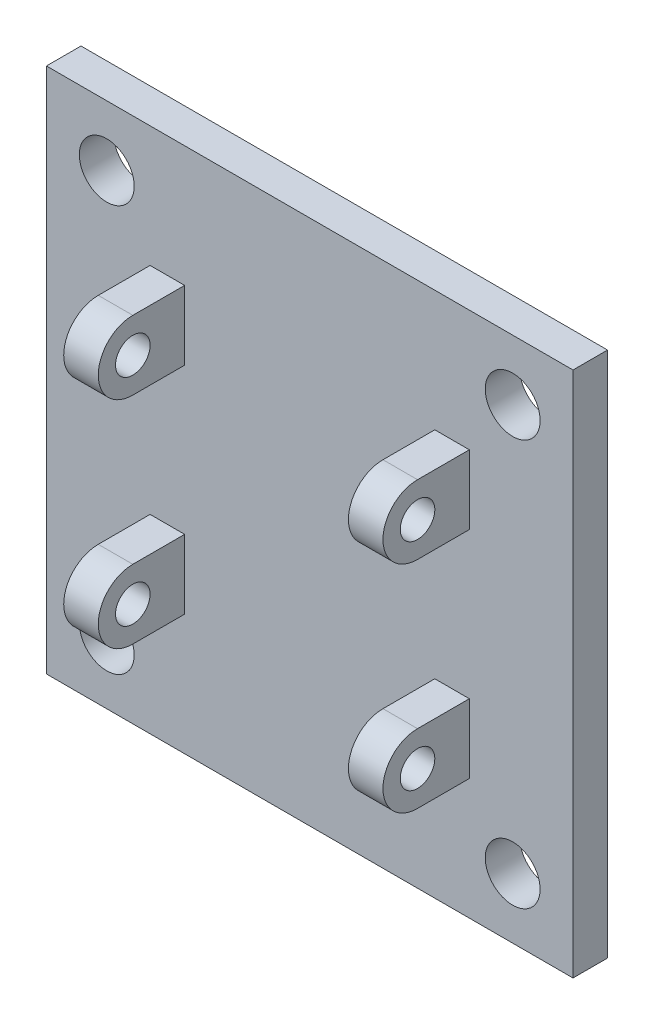
ISO-10303-21;
HEADER;
FILE_DESCRIPTION(('STEP AP214'),'2;1');
FILE_NAME('part.step','',(''),(''),'','','');
FILE_SCHEMA(('AUTOMOTIVE_DESIGN { 1 0 10303 214 1 1 1 1 }'));
ENDSEC;
DATA;
#1=APPLICATION_CONTEXT('core data for automotive mechanical design processes');
#2=APPLICATION_PROTOCOL_DEFINITION('international standard','automotive_design',2000,#1);
#3=PRODUCT_CONTEXT('',#1,'mechanical');
#4=PRODUCT('Part','Part','',(#3));
#5=PRODUCT_RELATED_PRODUCT_CATEGORY('part','',(#4));
#6=PRODUCT_DEFINITION_FORMATION('','',#4);
#7=PRODUCT_DEFINITION_CONTEXT('part definition',#1,'design');
#8=PRODUCT_DEFINITION('design','',#6,#7);
#9=PRODUCT_DEFINITION_SHAPE('','',#8);
#10=(LENGTH_UNIT() NAMED_UNIT(*) SI_UNIT(.MILLI.,.METRE.));
#11=(NAMED_UNIT(*) PLANE_ANGLE_UNIT() SI_UNIT($,.RADIAN.));
#12=(NAMED_UNIT(*) SI_UNIT($,.STERADIAN.) SOLID_ANGLE_UNIT());
#13=UNCERTAINTY_MEASURE_WITH_UNIT(LENGTH_MEASURE(1.E-05),#10,'distance_accuracy_value','');
#14=(GEOMETRIC_REPRESENTATION_CONTEXT(3) GLOBAL_UNCERTAINTY_ASSIGNED_CONTEXT((#13)) GLOBAL_UNIT_ASSIGNED_CONTEXT((#10,
#11,#12)) REPRESENTATION_CONTEXT('',''));
#15=CARTESIAN_POINT('',(0.,0.,0.));
#16=DIRECTION('',(0.,0.,1.));
#17=DIRECTION('',(1.,0.,0.));
#18=AXIS2_PLACEMENT_3D('',#15,#16,#17);
#19=CARTESIAN_POINT('',(0.,0.,10.));
#20=DIRECTION('',(0.,0.,-1.));
#21=DIRECTION('',(-1.,0.,0.));
#22=AXIS2_PLACEMENT_3D('',#19,#20,#21);
#23=PLANE('',#22);
#24=DIRECTION('',(-1.,0.,0.));
#25=VECTOR('',#24,1.);
#26=CARTESIAN_POINT('',(122.4,55.0000000000001,10.));
#27=LINE('',#26,#25);
#28=CARTESIAN_POINT('',(122.4,55.0000000000001,10.));
#29=VERTEX_POINT('',#28);
#30=CARTESIAN_POINT('',(112.4,55.0000000000001,10.));
#31=VERTEX_POINT('',#30);
#32=EDGE_CURVE('E64',#29,#31,#27,.T.);
#33=ORIENTED_EDGE('',*,*,#32,.F.);
#34=DIRECTION('',(0.,-1.,0.));
#35=VECTOR('',#34,1.);
#36=CARTESIAN_POINT('',(122.4,55.0000000000001,10.));
#37=LINE('',#36,#35);
#38=CARTESIAN_POINT('',(122.4,35.0000000000001,10.));
#39=VERTEX_POINT('',#38);
#40=EDGE_CURVE('E59',#29,#39,#37,.T.);
#41=ORIENTED_EDGE('',*,*,#40,.T.);
#42=DIRECTION('',(-1.,0.,0.));
#43=VECTOR('',#42,1.);
#44=CARTESIAN_POINT('',(122.4,35.0000000000001,10.));
#45=LINE('',#44,#43);
#46=CARTESIAN_POINT('',(112.4,35.0000000000001,10.));
#47=VERTEX_POINT('',#46);
#48=EDGE_CURVE('E192',#39,#47,#45,.T.);
#49=ORIENTED_EDGE('',*,*,#48,.T.);
#50=DIRECTION('',(0.,-1.,0.));
#51=VECTOR('',#50,1.);
#52=CARTESIAN_POINT('',(112.4,55.0000000000001,10.));
#53=LINE('',#52,#51);
#54=EDGE_CURVE('E219',#31,#47,#53,.T.);
#55=ORIENTED_EDGE('',*,*,#54,.F.);
#56=EDGE_LOOP('',(#33,#41,#49,#55));
#57=FACE_BOUND('',#56,.T.);
#58=DIRECTION('',(1.,0.,0.));
#59=VECTOR('',#58,1.);
#60=CARTESIAN_POINT('',(30.,55.0000000000001,10.));
#61=LINE('',#60,#59);
#62=CARTESIAN_POINT('',(30.,55.0000000000001,10.));
#63=VERTEX_POINT('',#62);
#64=CARTESIAN_POINT('',(40.,55.0000000000001,10.));
#65=VERTEX_POINT('',#64);
#66=EDGE_CURVE('E287',#63,#65,#61,.T.);
#67=ORIENTED_EDGE('',*,*,#66,.T.);
#68=DIRECTION('',(0.,-1.,0.));
#69=VECTOR('',#68,1.);
#70=CARTESIAN_POINT('',(40.,55.0000000000001,10.));
#71=LINE('',#70,#69);
#72=CARTESIAN_POINT('',(40.,35.0000000000001,10.));
#73=VERTEX_POINT('',#72);
#74=EDGE_CURVE('E302',#65,#73,#71,.T.);
#75=ORIENTED_EDGE('',*,*,#74,.T.);
#76=DIRECTION('',(1.,0.,0.));
#77=VECTOR('',#76,1.);
#78=CARTESIAN_POINT('',(30.,35.0000000000001,10.));
#79=LINE('',#78,#77);
#80=CARTESIAN_POINT('',(30.,35.0000000000001,10.));
#81=VERTEX_POINT('',#80);
#82=EDGE_CURVE('E290',#81,#73,#79,.T.);
#83=ORIENTED_EDGE('',*,*,#82,.F.);
#84=DIRECTION('',(0.,-1.,0.));
#85=VECTOR('',#84,1.);
#86=CARTESIAN_POINT('',(30.,55.0000000000001,10.));
#87=LINE('',#86,#85);
#88=EDGE_CURVE('E317',#63,#81,#87,.T.);
#89=ORIENTED_EDGE('',*,*,#88,.F.);
#90=EDGE_LOOP('',(#67,#75,#83,#89));
#91=FACE_BOUND('',#90,.T.);
#92=DIRECTION('',(0.,-1.,0.));
#93=VECTOR('',#92,1.);
#94=CARTESIAN_POINT('',(0.,0.,10.));
#95=LINE('',#94,#93);
#96=CARTESIAN_POINT('',(0.,152.4,10.));
#97=VERTEX_POINT('',#96);
#98=CARTESIAN_POINT('',(0.,0.,10.));
#99=VERTEX_POINT('',#98);
#100=EDGE_CURVE('E418',#97,#99,#95,.T.);
#101=ORIENTED_EDGE('',*,*,#100,.T.);
#102=DIRECTION('',(1.,0.,0.));
#103=VECTOR('',#102,1.);
#104=CARTESIAN_POINT('',(0.,0.,10.));
#105=LINE('',#104,#103);
#106=CARTESIAN_POINT('',(152.4,0.,10.));
#107=VERTEX_POINT('',#106);
#108=EDGE_CURVE('E422',#99,#107,#105,.T.);
#109=ORIENTED_EDGE('',*,*,#108,.T.);
#110=DIRECTION('',(0.,1.,0.));
#111=VECTOR('',#110,1.);
#112=CARTESIAN_POINT('',(152.4,0.,10.));
#113=LINE('',#112,#111);
#114=CARTESIAN_POINT('',(152.4,152.4,10.));
#115=VERTEX_POINT('',#114);
#116=EDGE_CURVE('E426',#107,#115,#113,.T.);
#117=ORIENTED_EDGE('',*,*,#116,.T.);
#118=DIRECTION('',(-1.,0.,0.));
#119=VECTOR('',#118,1.);
#120=CARTESIAN_POINT('',(0.,152.4,10.));
#121=LINE('',#120,#119);
#122=EDGE_CURVE('E429',#115,#97,#121,.T.);
#123=ORIENTED_EDGE('',*,*,#122,.T.);
#124=EDGE_LOOP('',(#101,#109,#117,#123));
#125=FACE_BOUND('',#124,.T.);
#126=CARTESIAN_POINT('',(134.94,17.46,10.));
#127=DIRECTION('',(0.,0.,1.));
#128=DIRECTION('',(1.,0.,0.));
#129=AXIS2_PLACEMENT_3D('',#126,#127,#128);
#130=CIRCLE('',#129,7.94);
#131=CARTESIAN_POINT('',(142.88,17.46,10.));
#132=VERTEX_POINT('',#131);
#133=EDGE_CURVE('E398',#132,#132,#130,.T.);
#134=ORIENTED_EDGE('',*,*,#133,.F.);
#135=EDGE_LOOP('',(#134));
#136=FACE_BOUND('',#135,.T.);
#137=CARTESIAN_POINT('',(17.46,134.94,10.));
#138=DIRECTION('',(0.,0.,1.));
#139=DIRECTION('',(-1.,0.,0.));
#140=AXIS2_PLACEMENT_3D('',#137,#138,#139);
#141=CIRCLE('',#140,7.94000000000001);
#142=CARTESIAN_POINT('',(9.51999999999999,134.94,10.));
#143=VERTEX_POINT('',#142);
#144=EDGE_CURVE('E386',#143,#143,#141,.T.);
#145=ORIENTED_EDGE('',*,*,#144,.F.);
#146=EDGE_LOOP('',(#145));
#147=FACE_BOUND('',#146,.T.);
#148=CARTESIAN_POINT('',(134.94,134.94,10.));
#149=DIRECTION('',(0.,0.,1.));
#150=DIRECTION('',(-1.,0.,0.));
#151=AXIS2_PLACEMENT_3D('',#148,#149,#150);
#152=CIRCLE('',#151,7.94);
#153=CARTESIAN_POINT('',(127.,134.94,10.));
#154=VERTEX_POINT('',#153);
#155=EDGE_CURVE('E403',#154,#154,#152,.T.);
#156=ORIENTED_EDGE('',*,*,#155,.F.);
#157=EDGE_LOOP('',(#156));
#158=FACE_BOUND('',#157,.T.);
#159=CARTESIAN_POINT('',(17.46,17.46,10.));
#160=DIRECTION('',(0.,0.,1.));
#161=DIRECTION('',(1.,0.,0.));
#162=AXIS2_PLACEMENT_3D('',#159,#160,#161);
#163=CIRCLE('',#162,7.94);
#164=CARTESIAN_POINT('',(25.4,17.46,10.));
#165=VERTEX_POINT('',#164);
#166=EDGE_CURVE('E394',#165,#165,#163,.T.);
#167=ORIENTED_EDGE('',*,*,#166,.F.);
#168=EDGE_LOOP('',(#167));
#169=FACE_BOUND('',#168,.T.);
#170=DIRECTION('',(1.,0.,0.));
#171=VECTOR('',#170,1.);
#172=CARTESIAN_POINT('',(30.,97.4,10.));
#173=LINE('',#172,#171);
#174=CARTESIAN_POINT('',(30.,97.4,10.));
#175=VERTEX_POINT('',#174);
#176=CARTESIAN_POINT('',(40.,97.4,10.));
#177=VERTEX_POINT('',#176);
#178=EDGE_CURVE('E381',#175,#177,#173,.T.);
#179=ORIENTED_EDGE('',*,*,#178,.F.);
#180=DIRECTION('',(0.,-1.,0.));
#181=VECTOR('',#180,1.);
#182=CARTESIAN_POINT('',(30.,97.4,10.));
#183=LINE('',#182,#181);
#184=CARTESIAN_POINT('',(30.,117.4,10.));
#185=VERTEX_POINT('',#184);
#186=EDGE_CURVE('E344',#185,#175,#183,.T.);
#187=ORIENTED_EDGE('',*,*,#186,.F.);
#188=DIRECTION('',(1.,0.,0.));
#189=VECTOR('',#188,1.);
#190=CARTESIAN_POINT('',(30.,117.4,10.));
#191=LINE('',#190,#189);
#192=CARTESIAN_POINT('',(40.,117.4,10.));
#193=VERTEX_POINT('',#192);
#194=EDGE_CURVE('E359',#185,#193,#191,.T.);
#195=ORIENTED_EDGE('',*,*,#194,.T.);
#196=DIRECTION('',(0.,-1.,0.));
#197=VECTOR('',#196,1.);
#198=CARTESIAN_POINT('',(40.,97.4,10.));
#199=LINE('',#198,#197);
#200=EDGE_CURVE('E340',#193,#177,#199,.T.);
#201=ORIENTED_EDGE('',*,*,#200,.T.);
#202=EDGE_LOOP('',(#179,#187,#195,#201));
#203=FACE_BOUND('',#202,.T.);
#204=DIRECTION('',(0.,-1.,0.));
#205=VECTOR('',#204,1.);
#206=CARTESIAN_POINT('',(122.4,97.4,10.));
#207=LINE('',#206,#205);
#208=CARTESIAN_POINT('',(122.4,117.4,10.));
#209=VERTEX_POINT('',#208);
#210=CARTESIAN_POINT('',(122.4,97.4,10.));
#211=VERTEX_POINT('',#210);
#212=EDGE_CURVE('E240',#209,#211,#207,.T.);
#213=ORIENTED_EDGE('',*,*,#212,.T.);
#214=DIRECTION('',(-1.,0.,0.));
#215=VECTOR('',#214,1.);
#216=CARTESIAN_POINT('',(122.4,97.4,10.));
#217=LINE('',#216,#215);
#218=CARTESIAN_POINT('',(112.4,97.4,10.));
#219=VERTEX_POINT('',#218);
#220=EDGE_CURVE('E257',#211,#219,#217,.T.);
#221=ORIENTED_EDGE('',*,*,#220,.T.);
#222=DIRECTION('',(0.,-1.,0.));
#223=VECTOR('',#222,1.);
#224=CARTESIAN_POINT('',(112.4,97.4,10.));
#225=LINE('',#224,#223);
#226=CARTESIAN_POINT('',(112.4,117.4,10.));
#227=VERTEX_POINT('',#226);
#228=EDGE_CURVE('E236',#227,#219,#225,.T.);
#229=ORIENTED_EDGE('',*,*,#228,.F.);
#230=DIRECTION('',(-1.,0.,0.));
#231=VECTOR('',#230,1.);
#232=CARTESIAN_POINT('',(122.4,117.4,10.));
#233=LINE('',#232,#231);
#234=EDGE_CURVE('E279',#209,#227,#233,.T.);
#235=ORIENTED_EDGE('',*,*,#234,.F.);
#236=EDGE_LOOP('',(#213,#221,#229,#235));
#237=FACE_BOUND('',#236,.T.);
#238=ADVANCED_FACE('F43',(#57,#91,#125,#136,#147,#158,#169,#203,#237),#23,.F.);
#239=CARTESIAN_POINT('',(0.,0.,10.));
#240=DIRECTION('',(1.,0.,0.));
#241=DIRECTION('',(0.,0.,-1.));
#242=AXIS2_PLACEMENT_3D('',#239,#240,#241);
#243=PLANE('',#242);
#244=DIRECTION('',(0.,-1.,0.));
#245=VECTOR('',#244,1.);
#246=CARTESIAN_POINT('',(0.,0.,0.));
#247=LINE('',#246,#245);
#248=CARTESIAN_POINT('',(0.,152.4,0.));
#249=VERTEX_POINT('',#248);
#250=CARTESIAN_POINT('',(0.,0.,0.));
#251=VERTEX_POINT('',#250);
#252=EDGE_CURVE('E414',#249,#251,#247,.T.);
#253=ORIENTED_EDGE('',*,*,#252,.T.);
#254=DIRECTION('',(0.,0.,-1.));
#255=VECTOR('',#254,1.);
#256=CARTESIAN_POINT('',(0.,0.,10.));
#257=LINE('',#256,#255);
#258=EDGE_CURVE('E11',#99,#251,#257,.T.);
#259=ORIENTED_EDGE('',*,*,#258,.F.);
#260=ORIENTED_EDGE('',*,*,#100,.F.);
#261=DIRECTION('',(0.,0.,-1.));
#262=VECTOR('',#261,1.);
#263=CARTESIAN_POINT('',(0.,152.4,10.));
#264=LINE('',#263,#262);
#265=EDGE_CURVE('E432',#97,#249,#264,.T.);
#266=ORIENTED_EDGE('',*,*,#265,.T.);
#267=EDGE_LOOP('',(#253,#259,#260,#266));
#268=FACE_BOUND('',#267,.T.);
#269=ADVANCED_FACE('F45',(#268),#243,.F.);
#270=CARTESIAN_POINT('',(0.,0.,10.));
#271=DIRECTION('',(0.,1.,0.));
#272=DIRECTION('',(0.,0.,1.));
#273=AXIS2_PLACEMENT_3D('',#270,#271,#272);
#274=PLANE('',#273);
#275=DIRECTION('',(1.,0.,0.));
#276=VECTOR('',#275,1.);
#277=CARTESIAN_POINT('',(0.,0.,0.));
#278=LINE('',#277,#276);
#279=CARTESIAN_POINT('',(152.4,0.,0.));
#280=VERTEX_POINT('',#279);
#281=EDGE_CURVE('E436',#251,#280,#278,.T.);
#282=ORIENTED_EDGE('',*,*,#281,.T.);
#283=DIRECTION('',(0.,0.,-1.));
#284=VECTOR('',#283,1.);
#285=CARTESIAN_POINT('',(152.4,0.,10.));
#286=LINE('',#285,#284);
#287=EDGE_CURVE('E52',#107,#280,#286,.T.);
#288=ORIENTED_EDGE('',*,*,#287,.F.);
#289=ORIENTED_EDGE('',*,*,#108,.F.);
#290=ORIENTED_EDGE('',*,*,#258,.T.);
#291=EDGE_LOOP('',(#282,#288,#289,#290));
#292=FACE_BOUND('',#291,.T.);
#293=ADVANCED_FACE('F472',(#292),#274,.F.);
#294=CARTESIAN_POINT('',(152.4,0.,10.));
#295=DIRECTION('',(-1.,0.,0.));
#296=DIRECTION('',(0.,0.,1.));
#297=AXIS2_PLACEMENT_3D('',#294,#295,#296);
#298=PLANE('',#297);
#299=DIRECTION('',(0.,1.,0.));
#300=VECTOR('',#299,1.);
#301=CARTESIAN_POINT('',(152.4,0.,0.));
#302=LINE('',#301,#300);
#303=CARTESIAN_POINT('',(152.4,152.4,0.));
#304=VERTEX_POINT('',#303);
#305=EDGE_CURVE('E439',#280,#304,#302,.T.);
#306=ORIENTED_EDGE('',*,*,#305,.T.);
#307=DIRECTION('',(0.,0.,-1.));
#308=VECTOR('',#307,1.);
#309=CARTESIAN_POINT('',(152.4,152.4,10.));
#310=LINE('',#309,#308);
#311=EDGE_CURVE('E447',#115,#304,#310,.T.);
#312=ORIENTED_EDGE('',*,*,#311,.F.);
#313=ORIENTED_EDGE('',*,*,#116,.F.);
#314=ORIENTED_EDGE('',*,*,#287,.T.);
#315=EDGE_LOOP('',(#306,#312,#313,#314));
#316=FACE_BOUND('',#315,.T.);
#317=ADVANCED_FACE('F456',(#316),#298,.F.);
#318=CARTESIAN_POINT('',(0.,152.4,10.));
#319=DIRECTION('',(0.,-1.,0.));
#320=DIRECTION('',(0.,0.,-1.));
#321=AXIS2_PLACEMENT_3D('',#318,#319,#320);
#322=PLANE('',#321);
#323=DIRECTION('',(-1.,0.,0.));
#324=VECTOR('',#323,1.);
#325=CARTESIAN_POINT('',(0.,152.4,0.));
#326=LINE('',#325,#324);
#327=EDGE_CURVE('E423',#304,#249,#326,.T.);
#328=ORIENTED_EDGE('',*,*,#327,.T.);
#329=ORIENTED_EDGE('',*,*,#265,.F.);
#330=ORIENTED_EDGE('',*,*,#122,.F.);
#331=ORIENTED_EDGE('',*,*,#311,.T.);
#332=EDGE_LOOP('',(#328,#329,#330,#331));
#333=FACE_BOUND('',#332,.T.);
#334=ADVANCED_FACE('F465',(#333),#322,.F.);
#335=CARTESIAN_POINT('',(0.,0.,0.));
#336=DIRECTION('',(0.,0.,-1.));
#337=DIRECTION('',(-1.,0.,0.));
#338=AXIS2_PLACEMENT_3D('',#335,#336,#337);
#339=PLANE('',#338);
#340=CARTESIAN_POINT('',(17.46,17.46,0.));
#341=DIRECTION('',(0.,0.,1.));
#342=DIRECTION('',(1.,0.,0.));
#343=AXIS2_PLACEMENT_3D('',#340,#341,#342);
#344=CIRCLE('',#343,7.94);
#345=CARTESIAN_POINT('',(25.4,17.46,0.));
#346=VERTEX_POINT('',#345);
#347=EDGE_CURVE('E399',#346,#346,#344,.T.);
#348=ORIENTED_EDGE('',*,*,#347,.T.);
#349=EDGE_LOOP('',(#348));
#350=FACE_BOUND('',#349,.T.);
#351=CARTESIAN_POINT('',(134.94,134.94,0.));
#352=DIRECTION('',(0.,0.,1.));
#353=DIRECTION('',(-1.,0.,0.));
#354=AXIS2_PLACEMENT_3D('',#351,#352,#353);
#355=CIRCLE('',#354,7.94);
#356=CARTESIAN_POINT('',(127.,134.94,0.));
#357=VERTEX_POINT('',#356);
#358=EDGE_CURVE('E390',#357,#357,#355,.T.);
#359=ORIENTED_EDGE('',*,*,#358,.T.);
#360=EDGE_LOOP('',(#359));
#361=FACE_BOUND('',#360,.T.);
#362=CARTESIAN_POINT('',(17.46,134.94,0.));
#363=DIRECTION('',(0.,0.,1.));
#364=DIRECTION('',(-1.,0.,0.));
#365=AXIS2_PLACEMENT_3D('',#362,#363,#364);
#366=CIRCLE('',#365,7.94000000000001);
#367=CARTESIAN_POINT('',(9.51999999999999,134.94,0.));
#368=VERTEX_POINT('',#367);
#369=EDGE_CURVE('E385',#368,#368,#366,.T.);
#370=ORIENTED_EDGE('',*,*,#369,.T.);
#371=EDGE_LOOP('',(#370));
#372=FACE_BOUND('',#371,.T.);
#373=CARTESIAN_POINT('',(134.94,17.46,0.));
#374=DIRECTION('',(0.,0.,1.));
#375=DIRECTION('',(1.,0.,0.));
#376=AXIS2_PLACEMENT_3D('',#373,#374,#375);
#377=CIRCLE('',#376,7.94);
#378=CARTESIAN_POINT('',(142.88,17.46,0.));
#379=VERTEX_POINT('',#378);
#380=EDGE_CURVE('E410',#379,#379,#377,.T.);
#381=ORIENTED_EDGE('',*,*,#380,.T.);
#382=EDGE_LOOP('',(#381));
#383=FACE_BOUND('',#382,.T.);
#384=ORIENTED_EDGE('',*,*,#252,.F.);
#385=ORIENTED_EDGE('',*,*,#327,.F.);
#386=ORIENTED_EDGE('',*,*,#305,.F.);
#387=ORIENTED_EDGE('',*,*,#281,.F.);
#388=EDGE_LOOP('',(#384,#385,#386,#387));
#389=FACE_BOUND('',#388,.T.);
#390=ADVANCED_FACE('F462',(#350,#361,#372,#383,#389),#339,.T.);
#391=CARTESIAN_POINT('',(134.94,17.46,0.));
#392=DIRECTION('',(0.,0.,1.));
#393=DIRECTION('',(1.,0.,0.));
#394=AXIS2_PLACEMENT_3D('',#391,#392,#393);
#395=CYLINDRICAL_SURFACE('',#394,7.94);
#396=ORIENTED_EDGE('',*,*,#380,.F.);
#397=EDGE_LOOP('',(#396));
#398=FACE_BOUND('',#397,.T.);
#399=ORIENTED_EDGE('',*,*,#133,.T.);
#400=EDGE_LOOP('',(#399));
#401=FACE_BOUND('',#400,.T.);
#402=ADVANCED_FACE('F486',(#398,#401),#395,.F.);
#403=CARTESIAN_POINT('',(17.46,134.94,0.));
#404=DIRECTION('',(0.,0.,1.));
#405=DIRECTION('',(1.,0.,0.));
#406=AXIS2_PLACEMENT_3D('',#403,#404,#405);
#407=CYLINDRICAL_SURFACE('',#406,7.94000000000001);
#408=ORIENTED_EDGE('',*,*,#369,.F.);
#409=EDGE_LOOP('',(#408));
#410=FACE_BOUND('',#409,.T.);
#411=ORIENTED_EDGE('',*,*,#144,.T.);
#412=EDGE_LOOP('',(#411));
#413=FACE_BOUND('',#412,.T.);
#414=ADVANCED_FACE('F506',(#410,#413),#407,.F.);
#415=CARTESIAN_POINT('',(134.94,134.94,0.));
#416=DIRECTION('',(0.,0.,1.));
#417=DIRECTION('',(1.,0.,0.));
#418=AXIS2_PLACEMENT_3D('',#415,#416,#417);
#419=CYLINDRICAL_SURFACE('',#418,7.94);
#420=ORIENTED_EDGE('',*,*,#358,.F.);
#421=EDGE_LOOP('',(#420));
#422=FACE_BOUND('',#421,.T.);
#423=ORIENTED_EDGE('',*,*,#155,.T.);
#424=EDGE_LOOP('',(#423));
#425=FACE_BOUND('',#424,.T.);
#426=ADVANCED_FACE('F513',(#422,#425),#419,.F.);
#427=CARTESIAN_POINT('',(17.46,17.46,0.));
#428=DIRECTION('',(0.,0.,1.));
#429=DIRECTION('',(1.,0.,0.));
#430=AXIS2_PLACEMENT_3D('',#427,#428,#429);
#431=CYLINDRICAL_SURFACE('',#430,7.94);
#432=ORIENTED_EDGE('',*,*,#347,.F.);
#433=EDGE_LOOP('',(#432));
#434=FACE_BOUND('',#433,.T.);
#435=ORIENTED_EDGE('',*,*,#166,.T.);
#436=EDGE_LOOP('',(#435));
#437=FACE_BOUND('',#436,.T.);
#438=ADVANCED_FACE('F521',(#434,#437),#431,.F.);
#439=CARTESIAN_POINT('',(30.,107.4,25.));
#440=DIRECTION('',(1.,0.,0.));
#441=DIRECTION('',(0.,0.,-1.));
#442=AXIS2_PLACEMENT_3D('',#439,#440,#441);
#443=PLANE('',#442);
#444=ORIENTED_EDGE('',*,*,#186,.T.);
#445=DIRECTION('',(0.,0.,1.));
#446=VECTOR('',#445,1.);
#447=CARTESIAN_POINT('',(30.,97.4,25.));
#448=LINE('',#447,#446);
#449=CARTESIAN_POINT('',(30.,97.4,25.));
#450=VERTEX_POINT('',#449);
#451=EDGE_CURVE('E348',#175,#450,#448,.T.);
#452=ORIENTED_EDGE('',*,*,#451,.T.);
#453=CARTESIAN_POINT('',(30.,107.4,25.));
#454=DIRECTION('',(-1.,0.,0.));
#455=DIRECTION('',(0.,0.,-1.));
#456=AXIS2_PLACEMENT_3D('',#453,#454,#455);
#457=CIRCLE('',#456,9.99999999999999);
#458=CARTESIAN_POINT('',(30.,117.4,25.));
#459=VERTEX_POINT('',#458);
#460=EDGE_CURVE('E352',#450,#459,#457,.T.);
#461=ORIENTED_EDGE('',*,*,#460,.T.);
#462=DIRECTION('',(0.,0.,-1.));
#463=VECTOR('',#462,1.);
#464=CARTESIAN_POINT('',(30.,117.4,10.));
#465=LINE('',#464,#463);
#466=EDGE_CURVE('E355',#459,#185,#465,.T.);
#467=ORIENTED_EDGE('',*,*,#466,.T.);
#468=EDGE_LOOP('',(#444,#452,#461,#467));
#469=FACE_BOUND('',#468,.T.);
#470=CARTESIAN_POINT('',(30.,107.4,25.));
#471=DIRECTION('',(-1.,0.,0.));
#472=DIRECTION('',(0.,0.,1.));
#473=AXIS2_PLACEMENT_3D('',#470,#471,#472);
#474=CIRCLE('',#473,5.);
#475=CARTESIAN_POINT('',(30.,107.4,30.));
#476=VERTEX_POINT('',#475);
#477=EDGE_CURVE('E336',#476,#476,#474,.T.);
#478=ORIENTED_EDGE('',*,*,#477,.F.);
#479=EDGE_LOOP('',(#478));
#480=FACE_BOUND('',#479,.T.);
#481=ADVANCED_FACE('F528',(#469,#480),#443,.F.);
#482=CARTESIAN_POINT('',(40.,107.4,25.));
#483=DIRECTION('',(1.,0.,0.));
#484=DIRECTION('',(0.,0.,-1.));
#485=AXIS2_PLACEMENT_3D('',#482,#483,#484);
#486=PLANE('',#485);
#487=ORIENTED_EDGE('',*,*,#200,.F.);
#488=DIRECTION('',(0.,0.,-1.));
#489=VECTOR('',#488,1.);
#490=CARTESIAN_POINT('',(40.,117.4,10.));
#491=LINE('',#490,#489);
#492=CARTESIAN_POINT('',(40.,117.4,25.));
#493=VERTEX_POINT('',#492);
#494=EDGE_CURVE('E349',#493,#193,#491,.T.);
#495=ORIENTED_EDGE('',*,*,#494,.F.);
#496=CARTESIAN_POINT('',(40.,107.4,25.));
#497=DIRECTION('',(-1.,0.,0.));
#498=DIRECTION('',(0.,0.,-1.));
#499=AXIS2_PLACEMENT_3D('',#496,#497,#498);
#500=CIRCLE('',#499,9.99999999999999);
#501=CARTESIAN_POINT('',(40.,97.4,25.));
#502=VERTEX_POINT('',#501);
#503=EDGE_CURVE('E365',#502,#493,#500,.T.);
#504=ORIENTED_EDGE('',*,*,#503,.F.);
#505=DIRECTION('',(0.,0.,1.));
#506=VECTOR('',#505,1.);
#507=CARTESIAN_POINT('',(40.,97.4,25.));
#508=LINE('',#507,#506);
#509=EDGE_CURVE('E362',#177,#502,#508,.T.);
#510=ORIENTED_EDGE('',*,*,#509,.F.);
#511=EDGE_LOOP('',(#487,#495,#504,#510));
#512=FACE_BOUND('',#511,.T.);
#513=CARTESIAN_POINT('',(40.,107.4,25.));
#514=DIRECTION('',(-1.,0.,0.));
#515=DIRECTION('',(0.,0.,1.));
#516=AXIS2_PLACEMENT_3D('',#513,#514,#515);
#517=CIRCLE('',#516,5.);
#518=CARTESIAN_POINT('',(40.,107.4,30.));
#519=VERTEX_POINT('',#518);
#520=EDGE_CURVE('E332',#519,#519,#517,.T.);
#521=ORIENTED_EDGE('',*,*,#520,.T.);
#522=EDGE_LOOP('',(#521));
#523=FACE_BOUND('',#522,.T.);
#524=ADVANCED_FACE('F536',(#512,#523),#486,.T.);
#525=CARTESIAN_POINT('',(30.,97.4,25.));
#526=DIRECTION('',(0.,1.,0.));
#527=DIRECTION('',(0.,0.,1.));
#528=AXIS2_PLACEMENT_3D('',#525,#526,#527);
#529=PLANE('',#528);
#530=ORIENTED_EDGE('',*,*,#509,.T.);
#531=DIRECTION('',(1.,0.,0.));
#532=VECTOR('',#531,1.);
#533=CARTESIAN_POINT('',(30.,97.4,25.));
#534=LINE('',#533,#532);
#535=EDGE_CURVE('E377',#450,#502,#534,.T.);
#536=ORIENTED_EDGE('',*,*,#535,.F.);
#537=ORIENTED_EDGE('',*,*,#451,.F.);
#538=ORIENTED_EDGE('',*,*,#178,.T.);
#539=EDGE_LOOP('',(#530,#536,#537,#538));
#540=FACE_BOUND('',#539,.T.);
#541=ADVANCED_FACE('F544',(#540),#529,.F.);
#542=CARTESIAN_POINT('',(30.,107.4,25.));
#543=DIRECTION('',(1.,0.,0.));
#544=DIRECTION('',(0.,0.,-1.));
#545=AXIS2_PLACEMENT_3D('',#542,#543,#544);
#546=CYLINDRICAL_SURFACE('',#545,9.99999999999999);
#547=ORIENTED_EDGE('',*,*,#503,.T.);
#548=DIRECTION('',(1.,0.,0.));
#549=VECTOR('',#548,1.);
#550=CARTESIAN_POINT('',(30.,117.4,25.));
#551=LINE('',#550,#549);
#552=EDGE_CURVE('E373',#459,#493,#551,.T.);
#553=ORIENTED_EDGE('',*,*,#552,.F.);
#554=ORIENTED_EDGE('',*,*,#460,.F.);
#555=ORIENTED_EDGE('',*,*,#535,.T.);
#556=EDGE_LOOP('',(#547,#553,#554,#555));
#557=FACE_BOUND('',#556,.T.);
#558=ADVANCED_FACE('F552',(#557),#546,.T.);
#559=CARTESIAN_POINT('',(30.,117.4,10.));
#560=DIRECTION('',(0.,-1.,0.));
#561=DIRECTION('',(0.,0.,-1.));
#562=AXIS2_PLACEMENT_3D('',#559,#560,#561);
#563=PLANE('',#562);
#564=ORIENTED_EDGE('',*,*,#494,.T.);
#565=ORIENTED_EDGE('',*,*,#194,.F.);
#566=ORIENTED_EDGE('',*,*,#466,.F.);
#567=ORIENTED_EDGE('',*,*,#552,.T.);
#568=EDGE_LOOP('',(#564,#565,#566,#567));
#569=FACE_BOUND('',#568,.T.);
#570=ADVANCED_FACE('F560',(#569),#563,.F.);
#571=CARTESIAN_POINT('',(30.,107.4,25.));
#572=DIRECTION('',(1.,0.,0.));
#573=DIRECTION('',(0.,0.,-1.));
#574=AXIS2_PLACEMENT_3D('',#571,#572,#573);
#575=CYLINDRICAL_SURFACE('',#574,5.);
#576=ORIENTED_EDGE('',*,*,#477,.T.);
#577=EDGE_LOOP('',(#576));
#578=FACE_BOUND('',#577,.T.);
#579=ORIENTED_EDGE('',*,*,#520,.F.);
#580=EDGE_LOOP('',(#579));
#581=FACE_BOUND('',#580,.T.);
#582=ADVANCED_FACE('F568',(#578,#581),#575,.F.);
#583=CARTESIAN_POINT('',(30.,45.0000000000001,25.));
#584=DIRECTION('',(-1.,0.,0.));
#585=DIRECTION('',(0.,0.,1.));
#586=AXIS2_PLACEMENT_3D('',#583,#584,#585);
#587=PLANE('',#586);
#588=CARTESIAN_POINT('',(30.,45.0000000000001,25.));
#589=DIRECTION('',(-1.,0.,0.));
#590=DIRECTION('',(0.,0.,1.));
#591=AXIS2_PLACEMENT_3D('',#588,#589,#590);
#592=CIRCLE('',#591,9.99999999999999);
#593=CARTESIAN_POINT('',(30.,35.0000000000001,25.));
#594=VERTEX_POINT('',#593);
#595=CARTESIAN_POINT('',(30.,55.0000000000001,25.));
#596=VERTEX_POINT('',#595);
#597=EDGE_CURVE('E303',#594,#596,#592,.T.);
#598=ORIENTED_EDGE('',*,*,#597,.T.);
#599=DIRECTION('',(0.,0.,-1.));
#600=VECTOR('',#599,1.);
#601=CARTESIAN_POINT('',(30.,55.0000000000001,25.));
#602=LINE('',#601,#600);
#603=EDGE_CURVE('E321',#596,#63,#602,.T.);
#604=ORIENTED_EDGE('',*,*,#603,.T.);
#605=ORIENTED_EDGE('',*,*,#88,.T.);
#606=DIRECTION('',(0.,0.,1.));
#607=VECTOR('',#606,1.);
#608=CARTESIAN_POINT('',(30.,35.0000000000001,10.));
#609=LINE('',#608,#607);
#610=EDGE_CURVE('E298',#81,#594,#609,.T.);
#611=ORIENTED_EDGE('',*,*,#610,.T.);
#612=EDGE_LOOP('',(#598,#604,#605,#611));
#613=FACE_BOUND('',#612,.T.);
#614=CARTESIAN_POINT('',(30.,45.0000000000001,25.));
#615=DIRECTION('',(-1.,0.,0.));
#616=DIRECTION('',(0.,0.,-1.));
#617=AXIS2_PLACEMENT_3D('',#614,#615,#616);
#618=CIRCLE('',#617,5.);
#619=CARTESIAN_POINT('',(30.,45.0000000000001,20.));
#620=VERTEX_POINT('',#619);
#621=EDGE_CURVE('E314',#620,#620,#618,.T.);
#622=ORIENTED_EDGE('',*,*,#621,.F.);
#623=EDGE_LOOP('',(#622));
#624=FACE_BOUND('',#623,.T.);
#625=ADVANCED_FACE('F576',(#613,#624),#587,.T.);
#626=CARTESIAN_POINT('',(40.,45.0000000000001,25.));
#627=DIRECTION('',(-1.,0.,0.));
#628=DIRECTION('',(0.,0.,1.));
#629=AXIS2_PLACEMENT_3D('',#626,#627,#628);
#630=PLANE('',#629);
#631=CARTESIAN_POINT('',(40.,45.0000000000001,25.));
#632=DIRECTION('',(-1.,0.,0.));
#633=DIRECTION('',(0.,0.,1.));
#634=AXIS2_PLACEMENT_3D('',#631,#632,#633);
#635=CIRCLE('',#634,9.99999999999999);
#636=CARTESIAN_POINT('',(40.,35.0000000000001,25.));
#637=VERTEX_POINT('',#636);
#638=CARTESIAN_POINT('',(40.,55.0000000000001,25.));
#639=VERTEX_POINT('',#638);
#640=EDGE_CURVE('E310',#637,#639,#635,.T.);
#641=ORIENTED_EDGE('',*,*,#640,.F.);
#642=DIRECTION('',(0.,0.,1.));
#643=VECTOR('',#642,1.);
#644=CARTESIAN_POINT('',(40.,35.0000000000001,10.));
#645=LINE('',#644,#643);
#646=EDGE_CURVE('E299',#73,#637,#645,.T.);
#647=ORIENTED_EDGE('',*,*,#646,.F.);
#648=ORIENTED_EDGE('',*,*,#74,.F.);
#649=DIRECTION('',(0.,0.,-1.));
#650=VECTOR('',#649,1.);
#651=CARTESIAN_POINT('',(40.,55.0000000000001,25.));
#652=LINE('',#651,#650);
#653=EDGE_CURVE('E306',#639,#65,#652,.T.);
#654=ORIENTED_EDGE('',*,*,#653,.F.);
#655=EDGE_LOOP('',(#641,#647,#648,#654));
#656=FACE_BOUND('',#655,.T.);
#657=CARTESIAN_POINT('',(40.,45.0000000000001,25.));
#658=DIRECTION('',(-1.,0.,0.));
#659=DIRECTION('',(0.,0.,-1.));
#660=AXIS2_PLACEMENT_3D('',#657,#658,#659);
#661=CIRCLE('',#660,5.);
#662=CARTESIAN_POINT('',(40.,45.0000000000001,20.));
#663=VERTEX_POINT('',#662);
#664=EDGE_CURVE('E328',#663,#663,#661,.T.);
#665=ORIENTED_EDGE('',*,*,#664,.T.);
#666=EDGE_LOOP('',(#665));
#667=FACE_BOUND('',#666,.T.);
#668=ADVANCED_FACE('F584',(#656,#667),#630,.F.);
#669=CARTESIAN_POINT('',(30.,45.0000000000001,25.));
#670=DIRECTION('',(1.,0.,0.));
#671=DIRECTION('',(0.,0.,-1.));
#672=AXIS2_PLACEMENT_3D('',#669,#670,#671);
#673=CYLINDRICAL_SURFACE('',#672,9.99999999999999);
#674=ORIENTED_EDGE('',*,*,#640,.T.);
#675=DIRECTION('',(1.,0.,0.));
#676=VECTOR('',#675,1.);
#677=CARTESIAN_POINT('',(30.,55.0000000000001,25.));
#678=LINE('',#677,#676);
#679=EDGE_CURVE('E283',#596,#639,#678,.T.);
#680=ORIENTED_EDGE('',*,*,#679,.F.);
#681=ORIENTED_EDGE('',*,*,#597,.F.);
#682=DIRECTION('',(1.,0.,0.));
#683=VECTOR('',#682,1.);
#684=CARTESIAN_POINT('',(30.,35.0000000000001,25.));
#685=LINE('',#684,#683);
#686=EDGE_CURVE('E294',#594,#637,#685,.T.);
#687=ORIENTED_EDGE('',*,*,#686,.T.);
#688=EDGE_LOOP('',(#674,#680,#681,#687));
#689=FACE_BOUND('',#688,.T.);
#690=ADVANCED_FACE('F592',(#689),#673,.T.);
#691=CARTESIAN_POINT('',(30.,55.0000000000001,25.));
#692=DIRECTION('',(0.,-1.,0.));
#693=DIRECTION('',(0.,0.,-1.));
#694=AXIS2_PLACEMENT_3D('',#691,#692,#693);
#695=PLANE('',#694);
#696=ORIENTED_EDGE('',*,*,#653,.T.);
#697=ORIENTED_EDGE('',*,*,#66,.F.);
#698=ORIENTED_EDGE('',*,*,#603,.F.);
#699=ORIENTED_EDGE('',*,*,#679,.T.);
#700=EDGE_LOOP('',(#696,#697,#698,#699));
#701=FACE_BOUND('',#700,.T.);
#702=ADVANCED_FACE('F600',(#701),#695,.F.);
#703=CARTESIAN_POINT('',(30.,35.0000000000001,10.));
#704=DIRECTION('',(0.,1.,0.));
#705=DIRECTION('',(0.,0.,1.));
#706=AXIS2_PLACEMENT_3D('',#703,#704,#705);
#707=PLANE('',#706);
#708=ORIENTED_EDGE('',*,*,#646,.T.);
#709=ORIENTED_EDGE('',*,*,#686,.F.);
#710=ORIENTED_EDGE('',*,*,#610,.F.);
#711=ORIENTED_EDGE('',*,*,#82,.T.);
#712=EDGE_LOOP('',(#708,#709,#710,#711));
#713=FACE_BOUND('',#712,.T.);
#714=ADVANCED_FACE('F608',(#713),#707,.F.);
#715=CARTESIAN_POINT('',(30.,45.0000000000001,25.));
#716=DIRECTION('',(1.,0.,0.));
#717=DIRECTION('',(0.,0.,-1.));
#718=AXIS2_PLACEMENT_3D('',#715,#716,#717);
#719=CYLINDRICAL_SURFACE('',#718,5.);
#720=ORIENTED_EDGE('',*,*,#621,.T.);
#721=EDGE_LOOP('',(#720));
#722=FACE_BOUND('',#721,.T.);
#723=ORIENTED_EDGE('',*,*,#664,.F.);
#724=EDGE_LOOP('',(#723));
#725=FACE_BOUND('',#724,.T.);
#726=ADVANCED_FACE('F616',(#722,#725),#719,.F.);
#727=CARTESIAN_POINT('',(122.4,117.4,10.));
#728=DIRECTION('',(0.,1.,0.));
#729=DIRECTION('',(0.,0.,1.));
#730=AXIS2_PLACEMENT_3D('',#727,#728,#729);
#731=PLANE('',#730);
#732=DIRECTION('',(0.,0.,-1.));
#733=VECTOR('',#732,1.);
#734=CARTESIAN_POINT('',(112.4,117.4,10.));
#735=LINE('',#734,#733);
#736=CARTESIAN_POINT('',(112.4,117.4,25.));
#737=VERTEX_POINT('',#736);
#738=EDGE_CURVE('E260',#737,#227,#735,.T.);
#739=ORIENTED_EDGE('',*,*,#738,.F.);
#740=DIRECTION('',(-1.,0.,0.));
#741=VECTOR('',#740,1.);
#742=CARTESIAN_POINT('',(122.4,117.4,25.));
#743=LINE('',#742,#741);
#744=CARTESIAN_POINT('',(122.4,117.4,25.));
#745=VERTEX_POINT('',#744);
#746=EDGE_CURVE('E276',#745,#737,#743,.T.);
#747=ORIENTED_EDGE('',*,*,#746,.F.);
#748=DIRECTION('',(0.,0.,-1.));
#749=VECTOR('',#748,1.);
#750=CARTESIAN_POINT('',(122.4,117.4,10.));
#751=LINE('',#750,#749);
#752=EDGE_CURVE('E244',#745,#209,#751,.T.);
#753=ORIENTED_EDGE('',*,*,#752,.T.);
#754=ORIENTED_EDGE('',*,*,#234,.T.);
#755=EDGE_LOOP('',(#739,#747,#753,#754));
#756=FACE_BOUND('',#755,.T.);
#757=ADVANCED_FACE('F624',(#756),#731,.T.);
#758=CARTESIAN_POINT('',(122.4,107.4,25.));
#759=DIRECTION('',(-1.,0.,0.));
#760=DIRECTION('',(0.,0.,1.));
#761=AXIS2_PLACEMENT_3D('',#758,#759,#760);
#762=CYLINDRICAL_SURFACE('',#761,9.99999999999999);
#763=CARTESIAN_POINT('',(112.4,107.4,25.));
#764=DIRECTION('',(-1.,0.,0.));
#765=DIRECTION('',(0.,0.,-1.));
#766=AXIS2_PLACEMENT_3D('',#763,#764,#765);
#767=CIRCLE('',#766,9.99999999999999);
#768=CARTESIAN_POINT('',(112.4,97.4,25.));
#769=VERTEX_POINT('',#768);
#770=EDGE_CURVE('E263',#769,#737,#767,.T.);
#771=ORIENTED_EDGE('',*,*,#770,.F.);
#772=DIRECTION('',(-1.,0.,0.));
#773=VECTOR('',#772,1.);
#774=CARTESIAN_POINT('',(122.4,97.4,25.));
#775=LINE('',#774,#773);
#776=CARTESIAN_POINT('',(122.4,97.4,25.));
#777=VERTEX_POINT('',#776);
#778=EDGE_CURVE('E273',#777,#769,#775,.T.);
#779=ORIENTED_EDGE('',*,*,#778,.F.);
#780=CARTESIAN_POINT('',(122.4,107.4,25.));
#781=DIRECTION('',(-1.,0.,0.));
#782=DIRECTION('',(0.,0.,-1.));
#783=AXIS2_PLACEMENT_3D('',#780,#781,#782);
#784=CIRCLE('',#783,9.99999999999999);
#785=EDGE_CURVE('E249',#777,#745,#784,.T.);
#786=ORIENTED_EDGE('',*,*,#785,.T.);
#787=ORIENTED_EDGE('',*,*,#746,.T.);
#788=EDGE_LOOP('',(#771,#779,#786,#787));
#789=FACE_BOUND('',#788,.T.);
#790=ADVANCED_FACE('F632',(#789),#762,.T.);
#791=CARTESIAN_POINT('',(122.4,97.4,25.));
#792=DIRECTION('',(0.,-1.,0.));
#793=DIRECTION('',(0.,0.,-1.));
#794=AXIS2_PLACEMENT_3D('',#791,#792,#793);
#795=PLANE('',#794);
#796=DIRECTION('',(0.,0.,1.));
#797=VECTOR('',#796,1.);
#798=CARTESIAN_POINT('',(112.4,97.4,25.));
#799=LINE('',#798,#797);
#800=EDGE_CURVE('E245',#219,#769,#799,.T.);
#801=ORIENTED_EDGE('',*,*,#800,.F.);
#802=ORIENTED_EDGE('',*,*,#220,.F.);
#803=DIRECTION('',(0.,0.,1.));
#804=VECTOR('',#803,1.);
#805=CARTESIAN_POINT('',(122.4,97.4,25.));
#806=LINE('',#805,#804);
#807=EDGE_CURVE('E253',#211,#777,#806,.T.);
#808=ORIENTED_EDGE('',*,*,#807,.T.);
#809=ORIENTED_EDGE('',*,*,#778,.T.);
#810=EDGE_LOOP('',(#801,#802,#808,#809));
#811=FACE_BOUND('',#810,.T.);
#812=ADVANCED_FACE('F640',(#811),#795,.T.);
#813=CARTESIAN_POINT('',(122.4,107.4,25.));
#814=DIRECTION('',(-1.,0.,0.));
#815=DIRECTION('',(0.,0.,-1.));
#816=AXIS2_PLACEMENT_3D('',#813,#814,#815);
#817=PLANE('',#816);
#818=CARTESIAN_POINT('',(122.4,107.4,25.));
#819=DIRECTION('',(-1.,0.,0.));
#820=DIRECTION('',(0.,0.,1.));
#821=AXIS2_PLACEMENT_3D('',#818,#819,#820);
#822=CIRCLE('',#821,5.);
#823=CARTESIAN_POINT('',(122.4,107.4,30.));
#824=VERTEX_POINT('',#823);
#825=EDGE_CURVE('E232',#824,#824,#822,.T.);
#826=ORIENTED_EDGE('',*,*,#825,.T.);
#827=EDGE_LOOP('',(#826));
#828=FACE_BOUND('',#827,.T.);
#829=ORIENTED_EDGE('',*,*,#212,.F.);
#830=ORIENTED_EDGE('',*,*,#752,.F.);
#831=ORIENTED_EDGE('',*,*,#785,.F.);
#832=ORIENTED_EDGE('',*,*,#807,.F.);
#833=EDGE_LOOP('',(#829,#830,#831,#832));
#834=FACE_BOUND('',#833,.T.);
#835=ADVANCED_FACE('F648',(#828,#834),#817,.F.);
#836=CARTESIAN_POINT('',(112.4,107.4,25.));
#837=DIRECTION('',(-1.,0.,0.));
#838=DIRECTION('',(0.,0.,-1.));
#839=AXIS2_PLACEMENT_3D('',#836,#837,#838);
#840=PLANE('',#839);
#841=CARTESIAN_POINT('',(112.4,107.4,25.));
#842=DIRECTION('',(-1.,0.,0.));
#843=DIRECTION('',(0.,0.,1.));
#844=AXIS2_PLACEMENT_3D('',#841,#842,#843);
#845=CIRCLE('',#844,5.);
#846=CARTESIAN_POINT('',(112.4,107.4,30.));
#847=VERTEX_POINT('',#846);
#848=EDGE_CURVE('E191',#847,#847,#845,.T.);
#849=ORIENTED_EDGE('',*,*,#848,.F.);
#850=EDGE_LOOP('',(#849));
#851=FACE_BOUND('',#850,.T.);
#852=ORIENTED_EDGE('',*,*,#228,.T.);
#853=ORIENTED_EDGE('',*,*,#800,.T.);
#854=ORIENTED_EDGE('',*,*,#770,.T.);
#855=ORIENTED_EDGE('',*,*,#738,.T.);
#856=EDGE_LOOP('',(#852,#853,#854,#855));
#857=FACE_BOUND('',#856,.T.);
#858=ADVANCED_FACE('F656',(#851,#857),#840,.T.);
#859=CARTESIAN_POINT('',(122.4,107.4,25.));
#860=DIRECTION('',(-1.,0.,0.));
#861=DIRECTION('',(0.,0.,1.));
#862=AXIS2_PLACEMENT_3D('',#859,#860,#861);
#863=CYLINDRICAL_SURFACE('',#862,5.);
#864=ORIENTED_EDGE('',*,*,#825,.F.);
#865=EDGE_LOOP('',(#864));
#866=FACE_BOUND('',#865,.T.);
#867=ORIENTED_EDGE('',*,*,#848,.T.);
#868=EDGE_LOOP('',(#867));
#869=FACE_BOUND('',#868,.T.);
#870=ADVANCED_FACE('F664',(#866,#869),#863,.F.);
#871=CARTESIAN_POINT('',(122.4,45.0000000000001,25.));
#872=DIRECTION('',(-1.,0.,0.));
#873=DIRECTION('',(0.,0.,1.));
#874=AXIS2_PLACEMENT_3D('',#871,#872,#873);
#875=CYLINDRICAL_SURFACE('',#874,9.99999999999999);
#876=CARTESIAN_POINT('',(112.4,45.0000000000001,25.));
#877=DIRECTION('',(-1.,0.,0.));
#878=DIRECTION('',(0.,0.,1.));
#879=AXIS2_PLACEMENT_3D('',#876,#877,#878);
#880=CIRCLE('',#879,9.99999999999999);
#881=CARTESIAN_POINT('',(112.4,35.0000000000001,25.));
#882=VERTEX_POINT('',#881);
#883=CARTESIAN_POINT('',(112.4,55.0000000000001,25.));
#884=VERTEX_POINT('',#883);
#885=EDGE_CURVE('E185',#882,#884,#880,.T.);
#886=ORIENTED_EDGE('',*,*,#885,.F.);
#887=DIRECTION('',(-1.,0.,0.));
#888=VECTOR('',#887,1.);
#889=CARTESIAN_POINT('',(122.4,35.0000000000001,25.));
#890=LINE('',#889,#888);
#891=CARTESIAN_POINT('',(122.4,35.0000000000001,25.));
#892=VERTEX_POINT('',#891);
#893=EDGE_CURVE('E179',#892,#882,#890,.T.);
#894=ORIENTED_EDGE('',*,*,#893,.F.);
#895=CARTESIAN_POINT('',(122.4,45.0000000000001,25.));
#896=DIRECTION('',(-1.,0.,0.));
#897=DIRECTION('',(0.,0.,1.));
#898=AXIS2_PLACEMENT_3D('',#895,#896,#897);
#899=CIRCLE('',#898,9.99999999999999);
#900=CARTESIAN_POINT('',(122.4,55.0000000000001,25.));
#901=VERTEX_POINT('',#900);
#902=EDGE_CURVE('E182',#892,#901,#899,.T.);
#903=ORIENTED_EDGE('',*,*,#902,.T.);
#904=DIRECTION('',(-1.,0.,0.));
#905=VECTOR('',#904,1.);
#906=CARTESIAN_POINT('',(122.4,55.0000000000001,25.));
#907=LINE('',#906,#905);
#908=EDGE_CURVE('E212',#901,#884,#907,.T.);
#909=ORIENTED_EDGE('',*,*,#908,.T.);
#910=EDGE_LOOP('',(#886,#894,#903,#909));
#911=FACE_BOUND('',#910,.T.);
#912=ADVANCED_FACE('F181',(#911),#875,.T.);
#913=CARTESIAN_POINT('',(122.4,35.0000000000001,10.));
#914=DIRECTION('',(0.,-1.,0.));
#915=DIRECTION('',(0.,0.,-1.));
#916=AXIS2_PLACEMENT_3D('',#913,#914,#915);
#917=PLANE('',#916);
#918=DIRECTION('',(0.,0.,1.));
#919=VECTOR('',#918,1.);
#920=CARTESIAN_POINT('',(112.4,35.0000000000001,10.));
#921=LINE('',#920,#919);
#922=EDGE_CURVE('E215',#47,#882,#921,.T.);
#923=ORIENTED_EDGE('',*,*,#922,.F.);
#924=ORIENTED_EDGE('',*,*,#48,.F.);
#925=DIRECTION('',(0.,0.,1.));
#926=VECTOR('',#925,1.);
#927=CARTESIAN_POINT('',(122.4,35.0000000000001,10.));
#928=LINE('',#927,#926);
#929=EDGE_CURVE('E197',#39,#892,#928,.T.);
#930=ORIENTED_EDGE('',*,*,#929,.T.);
#931=ORIENTED_EDGE('',*,*,#893,.T.);
#932=EDGE_LOOP('',(#923,#924,#930,#931));
#933=FACE_BOUND('',#932,.T.);
#934=ADVANCED_FACE('F203',(#933),#917,.T.);
#935=CARTESIAN_POINT('',(122.4,55.0000000000001,25.));
#936=DIRECTION('',(0.,1.,0.));
#937=DIRECTION('',(0.,0.,1.));
#938=AXIS2_PLACEMENT_3D('',#935,#936,#937);
#939=PLANE('',#938);
#940=DIRECTION('',(0.,0.,-1.));
#941=VECTOR('',#940,1.);
#942=CARTESIAN_POINT('',(112.4,55.0000000000001,25.));
#943=LINE('',#942,#941);
#944=EDGE_CURVE('E201',#884,#31,#943,.T.);
#945=ORIENTED_EDGE('',*,*,#944,.F.);
#946=ORIENTED_EDGE('',*,*,#908,.F.);
#947=DIRECTION('',(0.,0.,-1.));
#948=VECTOR('',#947,1.);
#949=CARTESIAN_POINT('',(122.4,55.0000000000001,25.));
#950=LINE('',#949,#948);
#951=EDGE_CURVE('E199',#901,#29,#950,.T.);
#952=ORIENTED_EDGE('',*,*,#951,.T.);
#953=ORIENTED_EDGE('',*,*,#32,.T.);
#954=EDGE_LOOP('',(#945,#946,#952,#953));
#955=FACE_BOUND('',#954,.T.);
#956=ADVANCED_FACE('F685',(#955),#939,.T.);
#957=CARTESIAN_POINT('',(122.4,45.0000000000001,25.));
#958=DIRECTION('',(1.,0.,0.));
#959=DIRECTION('',(0.,0.,1.));
#960=AXIS2_PLACEMENT_3D('',#957,#958,#959);
#961=PLANE('',#960);
#962=CARTESIAN_POINT('',(122.4,45.0000000000001,25.));
#963=DIRECTION('',(-1.,0.,0.));
#964=DIRECTION('',(0.,0.,-1.));
#965=AXIS2_PLACEMENT_3D('',#962,#963,#964);
#966=CIRCLE('',#965,5.);
#967=CARTESIAN_POINT('',(122.4,45.0000000000001,20.));
#968=VERTEX_POINT('',#967);
#969=EDGE_CURVE('E216',#968,#968,#966,.T.);
#970=ORIENTED_EDGE('',*,*,#969,.T.);
#971=EDGE_LOOP('',(#970));
#972=FACE_BOUND('',#971,.T.);
#973=ORIENTED_EDGE('',*,*,#902,.F.);
#974=ORIENTED_EDGE('',*,*,#929,.F.);
#975=ORIENTED_EDGE('',*,*,#40,.F.);
#976=ORIENTED_EDGE('',*,*,#951,.F.);
#977=EDGE_LOOP('',(#973,#974,#975,#976));
#978=FACE_BOUND('',#977,.T.);
#979=ADVANCED_FACE('F196',(#972,#978),#961,.T.);
#980=CARTESIAN_POINT('',(112.4,45.0000000000001,25.));
#981=DIRECTION('',(1.,0.,0.));
#982=DIRECTION('',(0.,0.,1.));
#983=AXIS2_PLACEMENT_3D('',#980,#981,#982);
#984=PLANE('',#983);
#985=CARTESIAN_POINT('',(112.4,45.0000000000001,25.));
#986=DIRECTION('',(-1.,0.,0.));
#987=DIRECTION('',(0.,0.,-1.));
#988=AXIS2_PLACEMENT_3D('',#985,#986,#987);
#989=CIRCLE('',#988,5.);
#990=CARTESIAN_POINT('',(112.4,45.0000000000001,20.));
#991=VERTEX_POINT('',#990);
#992=EDGE_CURVE('E869',#991,#991,#989,.T.);
#993=ORIENTED_EDGE('',*,*,#992,.F.);
#994=EDGE_LOOP('',(#993));
#995=FACE_BOUND('',#994,.T.);
#996=ORIENTED_EDGE('',*,*,#885,.T.);
#997=ORIENTED_EDGE('',*,*,#944,.T.);
#998=ORIENTED_EDGE('',*,*,#54,.T.);
#999=ORIENTED_EDGE('',*,*,#922,.T.);
#1000=EDGE_LOOP('',(#996,#997,#998,#999));
#1001=FACE_BOUND('',#1000,.T.);
#1002=ADVANCED_FACE('F699',(#995,#1001),#984,.F.);
#1003=CARTESIAN_POINT('',(122.4,45.0000000000001,25.));
#1004=DIRECTION('',(-1.,0.,0.));
#1005=DIRECTION('',(0.,0.,1.));
#1006=AXIS2_PLACEMENT_3D('',#1003,#1004,#1005);
#1007=CYLINDRICAL_SURFACE('',#1006,5.);
#1008=ORIENTED_EDGE('',*,*,#969,.F.);
#1009=EDGE_LOOP('',(#1008));
#1010=FACE_BOUND('',#1009,.T.);
#1011=ORIENTED_EDGE('',*,*,#992,.T.);
#1012=EDGE_LOOP('',(#1011));
#1013=FACE_BOUND('',#1012,.T.);
#1014=ADVANCED_FACE('F707',(#1010,#1013),#1007,.F.);
#1015=CLOSED_SHELL('',(#238,#269,#293,#317,#334,#390,#402,#414,#426,#438,#481,#524,#541,#558,
#570,#582,#625,#668,#690,#702,#714,#726,#757,#790,#812,#835,#858,#870,#912,#934,#956,#979,#1002,#1014));
#1016=MANIFOLD_SOLID_BREP('B2',#1015);
#1017=ADVANCED_BREP_SHAPE_REPRESENTATION('',(#18,#1016),#14);
#1018=SHAPE_DEFINITION_REPRESENTATION(#9,#1017);
ENDSEC;
END-ISO-10303-21;
